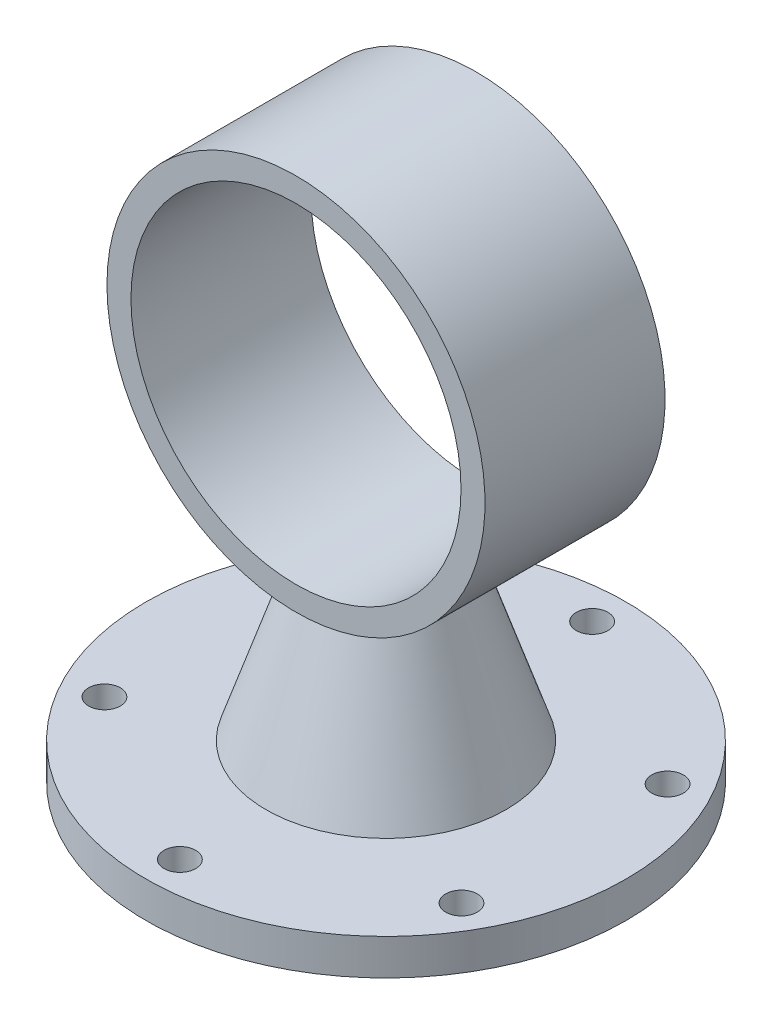
ISO-10303-21;
HEADER;
FILE_DESCRIPTION(('STEP AP214'),'2;1');
FILE_NAME('part.step','',(''),(''),'','','');
FILE_SCHEMA(('AUTOMOTIVE_DESIGN { 1 0 10303 214 1 1 1 1 }'));
ENDSEC;
DATA;
#1=APPLICATION_CONTEXT('core data for automotive mechanical design processes');
#2=APPLICATION_PROTOCOL_DEFINITION('international standard','automotive_design',2000,#1);
#3=PRODUCT_CONTEXT('',#1,'mechanical');
#4=PRODUCT('Part','Part','',(#3));
#5=PRODUCT_RELATED_PRODUCT_CATEGORY('part','',(#4));
#6=PRODUCT_DEFINITION_FORMATION('','',#4);
#7=PRODUCT_DEFINITION_CONTEXT('part definition',#1,'design');
#8=PRODUCT_DEFINITION('design','',#6,#7);
#9=PRODUCT_DEFINITION_SHAPE('','',#8);
#10=(LENGTH_UNIT() NAMED_UNIT(*) SI_UNIT(.MILLI.,.METRE.));
#11=(NAMED_UNIT(*) PLANE_ANGLE_UNIT() SI_UNIT($,.RADIAN.));
#12=(NAMED_UNIT(*) SI_UNIT($,.STERADIAN.) SOLID_ANGLE_UNIT());
#13=UNCERTAINTY_MEASURE_WITH_UNIT(LENGTH_MEASURE(1.E-05),#10,'distance_accuracy_value','');
#14=(GEOMETRIC_REPRESENTATION_CONTEXT(3) GLOBAL_UNCERTAINTY_ASSIGNED_CONTEXT((#13)) GLOBAL_UNIT_ASSIGNED_CONTEXT((#10,
#11,#12)) REPRESENTATION_CONTEXT('',''));
#15=CARTESIAN_POINT('',(0.,0.,0.));
#16=DIRECTION('',(0.,0.,1.));
#17=DIRECTION('',(1.,0.,0.));
#18=AXIS2_PLACEMENT_3D('',#15,#16,#17);
#19=CARTESIAN_POINT('',(0.,15.4305,0.));
#20=DIRECTION('',(0.,1.,0.));
#21=DIRECTION('',(1.,0.,0.));
#22=AXIS2_PLACEMENT_3D('',#19,#20,#21);
#23=PLANE('',#22);
#24=CARTESIAN_POINT('',(0.,15.4305,-26.));
#25=DIRECTION('',(0.,1.,0.));
#26=DIRECTION('',(1.,0.,0.));
#27=AXIS2_PLACEMENT_3D('',#24,#25,#26);
#28=CIRCLE('',#27,2.);
#29=CARTESIAN_POINT('',(-2.,15.4305,-26.));
#30=VERTEX_POINT('',#29);
#31=EDGE_CURVE('E133',#30,#30,#28,.T.);
#32=ORIENTED_EDGE('',*,*,#31,.T.);
#33=EDGE_LOOP('',(#32));
#34=FACE_BOUND('',#33,.T.);
#35=CARTESIAN_POINT('',(0.,15.4305,26.));
#36=DIRECTION('',(0.,1.,0.));
#37=DIRECTION('',(1.,0.,0.));
#38=AXIS2_PLACEMENT_3D('',#35,#36,#37);
#39=CIRCLE('',#38,2.);
#40=CARTESIAN_POINT('',(-2.,15.4305,26.));
#41=VERTEX_POINT('',#40);
#42=EDGE_CURVE('E122',#41,#41,#39,.T.);
#43=ORIENTED_EDGE('',*,*,#42,.T.);
#44=EDGE_LOOP('',(#43));
#45=FACE_BOUND('',#44,.T.);
#46=CARTESIAN_POINT('',(-22.5166604983954,15.4305,13.));
#47=DIRECTION('',(0.,1.,0.));
#48=DIRECTION('',(1.,0.,0.));
#49=AXIS2_PLACEMENT_3D('',#46,#47,#48);
#50=CIRCLE('',#49,2.);
#51=CARTESIAN_POINT('',(-24.5166604983954,15.4305,13.));
#52=VERTEX_POINT('',#51);
#53=EDGE_CURVE('E144',#52,#52,#50,.T.);
#54=ORIENTED_EDGE('',*,*,#53,.T.);
#55=EDGE_LOOP('',(#54));
#56=FACE_BOUND('',#55,.T.);
#57=CARTESIAN_POINT('',(-22.5166604983954,15.4305,-13.));
#58=DIRECTION('',(0.,1.,0.));
#59=DIRECTION('',(1.,0.,0.));
#60=AXIS2_PLACEMENT_3D('',#57,#58,#59);
#61=CIRCLE('',#60,2.);
#62=CARTESIAN_POINT('',(-24.5166604983954,15.4305,-13.));
#63=VERTEX_POINT('',#62);
#64=EDGE_CURVE('E94',#63,#63,#61,.T.);
#65=ORIENTED_EDGE('',*,*,#64,.T.);
#66=EDGE_LOOP('',(#65));
#67=FACE_BOUND('',#66,.T.);
#68=CARTESIAN_POINT('',(22.5166604983954,15.4305,-13.));
#69=DIRECTION('',(0.,1.,0.));
#70=DIRECTION('',(1.,0.,0.));
#71=AXIS2_PLACEMENT_3D('',#68,#69,#70);
#72=CIRCLE('',#71,2.);
#73=CARTESIAN_POINT('',(20.5166604983954,15.4305,-13.));
#74=VERTEX_POINT('',#73);
#75=EDGE_CURVE('E101',#74,#74,#72,.T.);
#76=ORIENTED_EDGE('',*,*,#75,.T.);
#77=EDGE_LOOP('',(#76));
#78=FACE_BOUND('',#77,.T.);
#79=CARTESIAN_POINT('',(22.5166604983954,15.4305,13.));
#80=DIRECTION('',(0.,1.,0.));
#81=DIRECTION('',(1.,0.,0.));
#82=AXIS2_PLACEMENT_3D('',#79,#80,#81);
#83=CIRCLE('',#82,2.);
#84=CARTESIAN_POINT('',(20.5166604983954,15.4305,13.));
#85=VERTEX_POINT('',#84);
#86=EDGE_CURVE('E117',#85,#85,#83,.T.);
#87=ORIENTED_EDGE('',*,*,#86,.T.);
#88=EDGE_LOOP('',(#87));
#89=FACE_BOUND('',#88,.T.);
#90=CARTESIAN_POINT('',(0.,15.4305,0.));
#91=DIRECTION('',(0.,1.,0.));
#92=DIRECTION('',(-1.,0.,0.));
#93=AXIS2_PLACEMENT_3D('',#90,#91,#92);
#94=CIRCLE('',#93,30.28);
#95=CARTESIAN_POINT('',(30.28,15.4305,0.));
#96=VERTEX_POINT('',#95);
#97=EDGE_CURVE('E11',#96,#96,#94,.T.);
#98=ORIENTED_EDGE('',*,*,#97,.F.);
#99=EDGE_LOOP('',(#98));
#100=FACE_BOUND('',#99,.T.);
#101=ADVANCED_FACE('F17',(#34,#45,#56,#67,#78,#89,#100),#23,.F.);
#102=CARTESIAN_POINT('',(0.,19.9725,0.));
#103=DIRECTION('',(0.,1.,0.));
#104=DIRECTION('',(1.,0.,0.));
#105=AXIS2_PLACEMENT_3D('',#102,#103,#104);
#106=PLANE('',#105);
#107=CARTESIAN_POINT('',(0.,19.9725,0.));
#108=DIRECTION('',(0.,-1.,0.));
#109=DIRECTION('',(-1.,0.,0.));
#110=AXIS2_PLACEMENT_3D('',#107,#108,#109);
#111=CIRCLE('',#110,15.14);
#112=CARTESIAN_POINT('',(15.14,19.9725,0.));
#113=VERTEX_POINT('',#112);
#114=EDGE_CURVE('E211',#113,#113,#111,.T.);
#115=ORIENTED_EDGE('',*,*,#114,.T.);
#116=EDGE_LOOP('',(#115));
#117=FACE_BOUND('',#116,.T.);
#118=CARTESIAN_POINT('',(0.,19.9725,-26.));
#119=DIRECTION('',(0.,-1.,0.));
#120=DIRECTION('',(1.,0.,0.));
#121=AXIS2_PLACEMENT_3D('',#118,#119,#120);
#122=CIRCLE('',#121,2.);
#123=CARTESIAN_POINT('',(-2.,19.9725,-26.));
#124=VERTEX_POINT('',#123);
#125=EDGE_CURVE('E118',#124,#124,#122,.T.);
#126=ORIENTED_EDGE('',*,*,#125,.T.);
#127=EDGE_LOOP('',(#126));
#128=FACE_BOUND('',#127,.T.);
#129=CARTESIAN_POINT('',(0.,19.9725,26.));
#130=DIRECTION('',(0.,-1.,0.));
#131=DIRECTION('',(1.,0.,0.));
#132=AXIS2_PLACEMENT_3D('',#129,#130,#131);
#133=CIRCLE('',#132,2.);
#134=CARTESIAN_POINT('',(-2.,19.9725,26.));
#135=VERTEX_POINT('',#134);
#136=EDGE_CURVE('E142',#135,#135,#133,.T.);
#137=ORIENTED_EDGE('',*,*,#136,.T.);
#138=EDGE_LOOP('',(#137));
#139=FACE_BOUND('',#138,.T.);
#140=CARTESIAN_POINT('',(-22.5166604983954,19.9725,13.));
#141=DIRECTION('',(0.,-1.,0.));
#142=DIRECTION('',(1.,0.,0.));
#143=AXIS2_PLACEMENT_3D('',#140,#141,#142);
#144=CIRCLE('',#143,2.);
#145=CARTESIAN_POINT('',(-24.5166604983954,19.9725,13.));
#146=VERTEX_POINT('',#145);
#147=EDGE_CURVE('E238',#146,#146,#144,.T.);
#148=ORIENTED_EDGE('',*,*,#147,.T.);
#149=EDGE_LOOP('',(#148));
#150=FACE_BOUND('',#149,.T.);
#151=CARTESIAN_POINT('',(-22.5166604983954,19.9725,-13.));
#152=DIRECTION('',(0.,-1.,0.));
#153=DIRECTION('',(1.,0.,0.));
#154=AXIS2_PLACEMENT_3D('',#151,#152,#153);
#155=CIRCLE('',#154,2.);
#156=CARTESIAN_POINT('',(-24.5166604983954,19.9725,-13.));
#157=VERTEX_POINT('',#156);
#158=EDGE_CURVE('E93',#157,#157,#155,.T.);
#159=ORIENTED_EDGE('',*,*,#158,.T.);
#160=EDGE_LOOP('',(#159));
#161=FACE_BOUND('',#160,.T.);
#162=CARTESIAN_POINT('',(22.5166604983954,19.9725,-13.));
#163=DIRECTION('',(0.,-1.,0.));
#164=DIRECTION('',(1.,0.,0.));
#165=AXIS2_PLACEMENT_3D('',#162,#163,#164);
#166=CIRCLE('',#165,2.);
#167=CARTESIAN_POINT('',(20.5166604983954,19.9725,-13.));
#168=VERTEX_POINT('',#167);
#169=EDGE_CURVE('E113',#168,#168,#166,.T.);
#170=ORIENTED_EDGE('',*,*,#169,.T.);
#171=EDGE_LOOP('',(#170));
#172=FACE_BOUND('',#171,.T.);
#173=CARTESIAN_POINT('',(22.5166604983954,19.9725,13.));
#174=DIRECTION('',(0.,-1.,0.));
#175=DIRECTION('',(1.,0.,0.));
#176=AXIS2_PLACEMENT_3D('',#173,#174,#175);
#177=CIRCLE('',#176,2.);
#178=CARTESIAN_POINT('',(20.5166604983954,19.9725,13.));
#179=VERTEX_POINT('',#178);
#180=EDGE_CURVE('E128',#179,#179,#177,.T.);
#181=ORIENTED_EDGE('',*,*,#180,.T.);
#182=EDGE_LOOP('',(#181));
#183=FACE_BOUND('',#182,.T.);
#184=CARTESIAN_POINT('',(0.,19.9725,0.));
#185=DIRECTION('',(0.,1.,0.));
#186=DIRECTION('',(-1.,0.,0.));
#187=AXIS2_PLACEMENT_3D('',#184,#185,#186);
#188=CIRCLE('',#187,30.28);
#189=CARTESIAN_POINT('',(30.28,19.9725,0.));
#190=VERTEX_POINT('',#189);
#191=EDGE_CURVE('E218',#190,#190,#188,.T.);
#192=ORIENTED_EDGE('',*,*,#191,.T.);
#193=EDGE_LOOP('',(#192));
#194=FACE_BOUND('',#193,.T.);
#195=ADVANCED_FACE('F98',(#117,#128,#139,#150,#161,#172,#183,#194),#106,.T.);
#196=CARTESIAN_POINT('',(0.,15.4305,0.));
#197=DIRECTION('',(0.,1.,0.));
#198=DIRECTION('',(-1.,0.,0.));
#199=AXIS2_PLACEMENT_3D('',#196,#197,#198);
#200=CYLINDRICAL_SURFACE('',#199,30.28);
#201=ORIENTED_EDGE('',*,*,#191,.F.);
#202=DIRECTION('',(0.,-1.,0.));
#203=VECTOR('',#202,1.);
#204=CARTESIAN_POINT('',(30.28,15.4305,0.));
#205=LINE('',#204,#203);
#206=EDGE_CURVE('E28',#190,#96,#205,.T.);
#207=ORIENTED_EDGE('',*,*,#206,.T.);
#208=ORIENTED_EDGE('',*,*,#97,.T.);
#209=ORIENTED_EDGE('',*,*,#206,.F.);
#210=EDGE_LOOP('',(#201,#207,#208,#209));
#211=FACE_BOUND('',#210,.T.);
#212=ADVANCED_FACE('F185',(#211),#200,.T.);
#213=CARTESIAN_POINT('',(0.,19.9725,0.));
#214=DIRECTION('',(0.,-1.,0.));
#215=DIRECTION('',(-1.,0.,0.));
#216=AXIS2_PLACEMENT_3D('',#213,#214,#215);
#217=CONICAL_SURFACE('',#216,15.14,0.321750554396642);
#218=CARTESIAN_POINT('',(8.10598397504346,41.0745480748695,0.));
#219=CARTESIAN_POINT('',(8.10599228552772,41.0745540208151,-0.134226241129684));
#220=CARTESIAN_POINT('',(8.1028935410508,41.0734310697929,-0.268445663162191));
#221=CARTESIAN_POINT('',(8.09057676877823,41.0689831641918,-0.537389582434754));
#222=CARTESIAN_POINT('',(8.08132149296634,41.065644806333,-0.672112159678158));
#223=CARTESIAN_POINT('',(8.0566866521417,41.0567864766006,-0.942060539232158));
#224=CARTESIAN_POINT('',(8.0412564344081,41.0512484639577,-1.0772811033043));
#225=CARTESIAN_POINT('',(8.0042778142821,41.0380366481614,-1.34822950689059));
#226=CARTESIAN_POINT('',(7.98266664241168,41.0303409497071,-1.48394767203641));
#227=CARTESIAN_POINT('',(7.93294622322821,41.0127380174252,-1.75786444264333));
#228=CARTESIAN_POINT('',(7.90467662864205,41.002776462063,-1.89603048453122));
#229=CARTESIAN_POINT('',(7.84209051245139,40.9808842187862,-2.16964907004523));
#230=CARTESIAN_POINT('',(7.80782473317279,40.9689701041103,-2.30511452114365));
#231=CARTESIAN_POINT('',(7.73323894846208,40.9432619239084,-2.57333337094648));
#232=CARTESIAN_POINT('',(7.69295532110676,40.9294791975679,-2.70609796205588));
#233=CARTESIAN_POINT('',(7.60630703274597,40.9001316911964,-2.96891364955428));
#234=CARTESIAN_POINT('',(7.55996390521049,40.8845732452708,-3.09897254828746));
#235=CARTESIAN_POINT('',(7.46125198232622,40.851814942625,-3.35628439300228));
#236=CARTESIAN_POINT('',(7.40889478376835,40.8346182554657,-3.48354219359469));
#237=CARTESIAN_POINT('',(7.2980012203605,40.7986682752877,-3.73585244968003));
#238=CARTESIAN_POINT('',(7.23943636327919,40.7799078973244,-3.86089136422041));
#239=CARTESIAN_POINT('',(7.1160910121384,40.7409725534611,-4.10876810734915));
#240=CARTESIAN_POINT('',(7.05126932933246,40.7207884875695,-4.23158399764496));
#241=CARTESIAN_POINT('',(6.91537987563583,40.6791655545478,-4.47502269635304));
#242=CARTESIAN_POINT('',(6.84425959620739,40.6577167588898,-4.59561446334909));
#243=CARTESIAN_POINT('',(6.69878712096547,40.6146398351422,-4.82972020267625));
#244=CARTESIAN_POINT('',(6.62459469453514,40.5930361572173,-4.94333799837689));
#245=CARTESIAN_POINT('',(6.47180503906243,40.549403989662,-5.16581816644314));
#246=CARTESIAN_POINT('',(6.39325801553339,40.5273817254114,-5.27471619252933));
#247=CARTESIAN_POINT('',(6.23174287146417,40.4830451733675,-5.48775963053089));
#248=CARTESIAN_POINT('',(6.14881379053932,40.4607344780282,-5.59193536623458));
#249=CARTESIAN_POINT('',(5.9785161388208,40.4159595905303,-5.79553708818833));
#250=CARTESIAN_POINT('',(5.89117520447296,40.3934969707572,-5.8949865224806));
#251=CARTESIAN_POINT('',(5.71119446348144,40.3483524027356,-6.09008738730319));
#252=CARTESIAN_POINT('',(5.6185253522981,40.3256699554786,-6.18571167499423));
#253=CARTESIAN_POINT('',(5.42839038863037,40.2803958110863,-6.37251974276535));
#254=CARTESIAN_POINT('',(5.33091464279367,40.2578044142869,-6.46369352410941));
#255=CARTESIAN_POINT('',(5.13114756005437,40.2128850851713,-6.6416069215847));
#256=CARTESIAN_POINT('',(5.02883693541597,40.1905587478645,-6.72832528043372));
#257=CARTESIAN_POINT('',(4.81939343396698,40.1463526267747,-6.89734366155247));
#258=CARTESIAN_POINT('',(4.71223323075272,40.1244767534334,-6.97961081550864));
#259=CARTESIAN_POINT('',(4.49023431028415,40.0808003873347,-7.14179083994862));
#260=CARTESIAN_POINT('',(4.37525819966085,40.0590287202313,-7.22152362064177));
#261=CARTESIAN_POINT('',(4.14272272102674,40.0168252089888,-7.37408391605919));
#262=CARTESIAN_POINT('',(4.02521540327887,39.9963797614168,-7.44698688391547));
#263=CARTESIAN_POINT('',(3.7876428587313,39.956933549685,-7.58590142892722));
#264=CARTESIAN_POINT('',(3.66761740953222,39.93791987766,-7.65197729012282));
#265=CARTESIAN_POINT('',(3.42503212438874,39.9014418253488,-7.77724819704724));
#266=CARTESIAN_POINT('',(3.3025002287703,39.8839662721872,-7.83649403900675));
#267=CARTESIAN_POINT('',(3.05337429850847,39.850461259448,-7.94882112154026));
#268=CARTESIAN_POINT('',(2.92675745878384,39.8344430511457,-8.00185518071147));
#269=CARTESIAN_POINT('',(2.67057885235985,39.8041664791088,-8.10113662434849));
#270=CARTESIAN_POINT('',(2.54101503721802,39.7899093867222,-8.14737911048218));
#271=CARTESIAN_POINT('',(2.27897049093139,39.7632864983942,-8.23309671714051));
#272=CARTESIAN_POINT('',(2.14648113528276,39.7509274990714,-8.27254757675482));
#273=CARTESIAN_POINT('',(1.87861691314948,39.7282342572368,-8.34470058842314));
#274=CARTESIAN_POINT('',(1.74322920675397,39.7179131183138,-8.37735913270832));
#275=CARTESIAN_POINT('',(1.47338222827223,39.6996857401668,-8.43513931964788));
#276=CARTESIAN_POINT('',(1.33895380649629,39.6917375288183,-8.46039179774045));
#277=CARTESIAN_POINT('',(1.0703529665686,39.6781593407874,-8.50360966340676));
#278=CARTESIAN_POINT('',(0.936194451879281,39.672504468489,-8.52165327389404));
#279=CARTESIAN_POINT('',(0.668182043726237,39.6634896319526,-8.55046785172429));
#280=CARTESIAN_POINT('',(0.534335370036393,39.6601104409051,-8.56129974047415));
#281=CARTESIAN_POINT('',(0.266990835086297,39.6556221543521,-8.57571080381577));
#282=CARTESIAN_POINT('',(0.13349545672282,39.6544999996571,-8.57933169992799));
#283=CARTESIAN_POINT('',(-0.133454477455421,39.6545000003428,-8.57933496623726));
#284=CARTESIAN_POINT('',(-0.266909033222084,39.6556214668907,-8.57571955811247));
#285=CARTESIAN_POINT('',(-0.534199211973135,39.6601074656276,-8.56131581095495));
#286=CARTESIAN_POINT('',(-0.668032264384554,39.6634855115075,-8.55048425857094));
#287=CARTESIAN_POINT('',(-0.936044664199146,39.6724985057343,-8.52166897670078));
#288=CARTESIAN_POINT('',(-1.07021661975496,39.6781531352781,-8.50362288691295));
#289=CARTESIAN_POINT('',(-1.33887214324759,39.6917327062201,-8.46040054900051));
#290=CARTESIAN_POINT('',(-1.47334157000986,39.6996829933127,-8.43514473792432));
#291=CARTESIAN_POINT('',(-1.74318888003728,39.7179103948777,-8.37737111645127));
#292=CARTESIAN_POINT('',(-1.87853688811407,39.7282281623238,-8.34472658292363));
#293=CARTESIAN_POINT('',(-2.14634834409802,39.7509155690328,-8.27259224221701));
#294=CARTESIAN_POINT('',(-2.27882422326767,39.7632725317862,-8.23314466138967));
#295=CARTESIAN_POINT('',(-2.54086872418094,39.7898936320559,-8.1474263751858));
#296=CARTESIAN_POINT('',(-2.67044547044304,39.8041513674904,-8.10117852251852));
#297=CARTESIAN_POINT('',(-2.92667782701638,39.8344329885802,-8.00188116058868));
#298=CARTESIAN_POINT('',(-3.0533349069009,39.8504559611708,-7.94883516535262));
#299=CARTESIAN_POINT('',(-3.30246342902233,39.8839613234649,-7.8365143200287));
#300=CARTESIAN_POINT('',(-3.4249596290129,39.9014314967356,-7.7772906966396));
#301=CARTESIAN_POINT('',(-3.66749752723076,39.9379012737716,-7.6520493940719));
#302=CARTESIAN_POINT('',(-3.78751055780025,39.9569123286154,-7.58597959013245));
#303=CARTESIAN_POINT('',(-4.02508301125295,39.9963570260611,-7.44706443950968));
#304=CARTESIAN_POINT('',(-4.14260189047806,40.0168038244582,-7.37415357420716));
#305=CARTESIAN_POINT('',(-4.37518624722481,40.0590151091939,-7.22156610175574));
#306=CARTESIAN_POINT('',(-4.49019890244395,40.0807934208883,-7.14181292487126));
#307=CARTESIAN_POINT('',(-4.7122019653679,40.1244706024909,-6.97963730958388));
#308=CARTESIAN_POINT('',(-4.81933218265364,40.1463401342361,-6.89739814134485));
#309=CARTESIAN_POINT('',(-5.02873589114185,40.1905369886015,-6.7284170315032));
#310=CARTESIAN_POINT('',(-5.13103588538245,40.2128605260781,-6.64170697097608));
#311=CARTESIAN_POINT('',(-5.33080279353243,40.2577787150375,-6.46379309090589));
#312=CARTESIAN_POINT('',(-5.428288100483,40.2803718457265,-6.37260954170426));
#313=CARTESIAN_POINT('',(-5.6184646307383,40.3256551067791,-6.1857661503857));
#314=CARTESIAN_POINT('',(-5.71116480420827,40.3483449632398,-6.09011535354834));
#315=CARTESIAN_POINT('',(-5.89114964752676,40.3934905603687,-5.89501838300296));
#316=CARTESIAN_POINT('',(-5.97846655072113,40.4159468491915,-5.79560206700473));
#317=CARTESIAN_POINT('',(-6.14873233262076,40.4607127630418,-5.59204448367217));
#318=CARTESIAN_POINT('',(-6.23165255762026,40.4830207530186,-5.48787890332985));
#319=CARTESIAN_POINT('',(-6.39316741660652,40.527356481948,-5.27483507390466));
#320=CARTESIAN_POINT('',(-6.4717219918158,40.5493805345838,-5.16592571086832));
#321=CARTESIAN_POINT('',(-6.62454553108781,40.5930218543776,-4.94340297744406));
#322=CARTESIAN_POINT('',(-6.69876329843015,40.6146327810176,-4.82975324966532));
#323=CARTESIAN_POINT('',(-6.84423984138364,40.6577109089981,-4.59565170391255));
#324=CARTESIAN_POINT('',(-6.91534201433778,40.6791541471022,-4.4750981125657));
#325=CARTESIAN_POINT('',(-7.05120744847361,40.7207693457471,-4.23171028384059));
#326=CARTESIAN_POINT('',(-7.11602211419825,40.7409510307606,-4.10890643715852));
#327=CARTESIAN_POINT('',(-7.23936703317627,40.7798857885693,-3.86102939427003));
#328=CARTESIAN_POINT('',(-7.2979372949484,40.798647700716,-3.73597750651334));
#329=CARTESIAN_POINT('',(-7.40885719807603,40.8346059225375,-3.48361760802232));
#330=CARTESIAN_POINT('',(-7.46123410393945,40.8518090097664,-3.35632255506132));
#331=CARTESIAN_POINT('',(-7.55995167820104,40.8845691874242,-3.09901287269031));
#332=CARTESIAN_POINT('',(-7.60628447587182,40.9001241267604,-2.9689949480903));
#333=CARTESIAN_POINT('',(-7.69291905841035,40.9294668397403,-2.70623385787374));
#334=CARTESIAN_POINT('',(-7.73319803950913,40.9432479048239,-2.57348242907009));
#335=CARTESIAN_POINT('',(-7.80778322710309,40.9689557160509,-2.30526337891982));
#336=CARTESIAN_POINT('',(-7.84205179657443,40.980870730563,-2.16978417893301));
#337=CARTESIAN_POINT('',(-7.90465426321771,41.0027685839608,-1.89611178914783));
#338=CARTESIAN_POINT('',(-7.93293620743287,41.0127344554377,-1.75790538284825));
#339=CARTESIAN_POINT('',(-7.98265796966322,41.0303378947999,-1.48400930325459));
#340=CARTESIAN_POINT('',(-8.00426263788001,41.0380313077414,-1.3483531134475));
#341=CARTESIAN_POINT('',(-8.04123238844538,41.051239791827,-1.07748712677671));
#342=CARTESIAN_POINT('',(-8.05665847742817,41.0567761458976,-0.94228673517096));
#343=CARTESIAN_POINT('',(-8.08129372850655,41.0656350195064,-0.67233890239427));
#344=CARTESIAN_POINT('',(-8.090551661023,41.0689749033239,-0.537596496828097));
#345=CARTESIAN_POINT('',(-8.10287576428526,41.073423854315,-0.268568257438402));
#346=CARTESIAN_POINT('',(-8.10597730841317,41.0745456659441,-0.134284267071368));
#347=CARTESIAN_POINT('',(-8.10599063654547,41.0745504819419,0.134180968299907));
#348=CARTESIAN_POINT('',(-8.10290718021509,41.0734352078591,0.268362212878599));
#349=CARTESIAN_POINT('',(-8.09060663079576,41.0689947348015,0.537253556233039));
#350=CARTESIAN_POINT('',(-8.08135094248745,41.0656556302948,0.67196164668727));
#351=CARTESIAN_POINT('',(-8.05671431445401,41.056796188329,0.941909511683192));
#352=CARTESIAN_POINT('',(-8.04128147957607,41.0512573739201,1.07714392482473));
#353=CARTESIAN_POINT('',(-8.00429375088915,41.0380423806461,1.34814744509327));
#354=CARTESIAN_POINT('',(-7.98267486366089,41.0303438774818,1.48390668659693));
#355=CARTESIAN_POINT('',(-7.93294545035107,41.0127377261999,1.75786427849699));
#356=CARTESIAN_POINT('',(-7.90467642237258,41.0027763843393,1.89603044072427));
#357=CARTESIAN_POINT('',(-7.84209071705222,40.9808842958812,2.1696491135017));
#358=CARTESIAN_POINT('',(-7.80782478783994,40.9689701247093,2.30511453275677));
#359=CARTESIAN_POINT('',(-7.7332388941118,40.9432619034289,2.57333335940601));
#360=CARTESIAN_POINT('',(-7.69295530656762,40.9294791920895,2.70609795897046));
#361=CARTESIAN_POINT('',(-7.60630704723406,40.9001316966557,2.96891365263277));
#362=CARTESIAN_POINT('',(-7.55996390908936,40.8845732467324,3.0989725491119));
#363=CARTESIAN_POINT('',(-7.46125197844377,40.8518149411625,3.35628439220852));
#364=CARTESIAN_POINT('',(-7.40889478270691,40.8346182550668,3.48354219343078));
#365=CARTESIAN_POINT('',(-7.29800122136911,40.7986682756697,3.73585244999664));
#366=CARTESIAN_POINT('',(-7.23943636352045,40.7799078974176,3.86089136438442));
#367=CARTESIAN_POINT('',(-7.11609101181576,40.7409725533421,4.10876810739358));
#368=CARTESIAN_POINT('',(-7.051269329221,40.7207884875299,4.23158399772431));
#369=CARTESIAN_POINT('',(-6.91537987569111,40.6791655545702,4.47502269642666));
#370=CARTESIAN_POINT('',(-6.84425959621656,40.6577167588941,4.595614463382));
#371=CARTESIAN_POINT('',(-6.69878712093931,40.6146398351329,4.82972020267173));
#372=CARTESIAN_POINT('',(-6.6245946945164,40.5930361572114,4.94333799837441));
#373=CARTESIAN_POINT('',(-6.47180503904536,40.5494039896577,5.16581816644189));
#374=CARTESIAN_POINT('',(-6.3932580155108,40.5273817254053,5.27471619252735));
#375=CARTESIAN_POINT('',(-6.23174287143887,40.4830451733605,5.48775963052823));
#376=CARTESIAN_POINT('',(-6.14881379051687,40.4607344780222,5.59193536623202));
#377=CARTESIAN_POINT('',(-5.97851613880779,40.415959590527,5.79553708818678));
#378=CARTESIAN_POINT('',(-5.89117520446664,40.3934969707557,5.89498652248003));
#379=CARTESIAN_POINT('',(-5.71119446350289,40.348352402741,6.09008738728722));
#380=CARTESIAN_POINT('',(-5.61852535234143,40.3256699554892,6.18571167496263));
#381=CARTESIAN_POINT('',(-5.42839038870294,40.2803958111033,6.37251974271291));
#382=CARTESIAN_POINT('',(-5.33091464287298,40.2578044143052,6.46369352405113));
#383=CARTESIAN_POINT('',(-5.13114756013365,40.2128850851888,6.64160692152625));
#384=CARTESIAN_POINT('',(-5.02883693548788,40.19055874788,6.72832528038028));
#385=CARTESIAN_POINT('',(-4.81939343401048,40.1463526267836,6.89734366152076));
#386=CARTESIAN_POINT('',(-4.71223323077462,40.1244767534377,6.97961081549298));
#387=CARTESIAN_POINT('',(-4.49023431028487,40.0808003873348,7.14179083994776));
#388=CARTESIAN_POINT('',(-4.37525819966284,40.0590287202317,7.22152362064077));
#389=CARTESIAN_POINT('',(-4.14272272103027,40.0168252089894,7.37408391605783));
#390=CARTESIAN_POINT('',(-4.02521540328268,39.9963797614174,7.44698688391385));
#391=CARTESIAN_POINT('',(-3.78764285873505,39.9569335496856,7.58590142892553));
#392=CARTESIAN_POINT('',(-3.66761740953563,39.9379198776605,7.65197729012128));
#393=CARTESIAN_POINT('',(-3.4250321243908,39.9014418253491,7.77724819704635));
#394=CARTESIAN_POINT('',(-3.30250022877133,39.8839662721873,7.83649403900632));
#395=CARTESIAN_POINT('',(-3.05337429850844,39.850461259448,7.94882112154025));
#396=CARTESIAN_POINT('',(-2.92675745878381,39.8344430511457,8.00185518071147));
#397=CARTESIAN_POINT('',(-2.67057885235982,39.8041664791088,8.10113662434849));
#398=CARTESIAN_POINT('',(-2.541015037218,39.7899093867222,8.14737911048218));
#399=CARTESIAN_POINT('',(-2.27897049093137,39.7632864983942,8.23309671714051));
#400=CARTESIAN_POINT('',(-2.14648113528274,39.7509274990714,8.27254757675482));
#401=CARTESIAN_POINT('',(-1.87861691314948,39.7282342572368,8.34470058842314));
#402=CARTESIAN_POINT('',(-1.74322920675397,39.7179131183138,8.37735913270833));
#403=CARTESIAN_POINT('',(-1.47338222827223,39.6996857401668,8.43513931964789));
#404=CARTESIAN_POINT('',(-1.3389538064963,39.6917375288183,8.46039179774046));
#405=CARTESIAN_POINT('',(-1.0703529665686,39.6781593407874,8.50360966340677));
#406=CARTESIAN_POINT('',(-0.93619445187929,39.672504468489,8.52165327389406));
#407=CARTESIAN_POINT('',(-0.668182043726246,39.6634896319526,8.55046785172428));
#408=CARTESIAN_POINT('',(-0.534335370036402,39.6601104409051,8.5612997404741));
#409=CARTESIAN_POINT('',(-0.266990835086305,39.6556221543521,8.57571080381582));
#410=CARTESIAN_POINT('',(-0.133495456722827,39.6544999996571,8.57933169992818));
#411=CARTESIAN_POINT('',(0.133454477446243,39.6545000003428,8.57933496623707));
#412=CARTESIAN_POINT('',(0.266909033203734,39.6556214668906,8.57571955811224));
#413=CARTESIAN_POINT('',(0.534199211942556,39.6601074656269,8.56131581095483));
#414=CARTESIAN_POINT('',(0.668032264350899,39.6634855115066,8.55048425857064));
#415=CARTESIAN_POINT('',(0.936044664165465,39.672498505733,8.52166897670041));
#416=CARTESIAN_POINT('',(1.07021661972429,39.6781531352767,8.50362288691237));
#417=CARTESIAN_POINT('',(1.33887214322915,39.691732706219,8.46040054900014));
#418=CARTESIAN_POINT('',(1.47334157000059,39.6996829933121,8.43514473792406));
#419=CARTESIAN_POINT('',(1.74318888004591,39.7179103948783,8.37737111645168));
#420=CARTESIAN_POINT('',(1.87853688813144,39.7282281623252,8.34472658292463));
#421=CARTESIAN_POINT('',(2.14634834412692,39.7509155690354,8.27259224221834));
#422=CARTESIAN_POINT('',(2.27882422329944,39.7632725317893,8.23314466139103));
#423=CARTESIAN_POINT('',(2.54086872421282,39.7898936320593,8.14742637518731));
#424=CARTESIAN_POINT('',(2.67044547047225,39.8041513674937,8.10117852252042));
#425=CARTESIAN_POINT('',(2.92667782703383,39.8344329885824,8.00188116058953));
#426=CARTESIAN_POINT('',(3.05333490690936,39.850455961172,7.94883516535228));
#427=CARTESIAN_POINT('',(3.3024634290572,39.8839613234696,7.8365143200095));
#428=CARTESIAN_POINT('',(3.42495962908205,39.9014314967454,7.7772906966004));
#429=CARTESIAN_POINT('',(3.66749752734529,39.9379012737894,7.65204939400577));
#430=CARTESIAN_POINT('',(3.78751055792658,39.9569123286357,7.58597959006063));
#431=CARTESIAN_POINT('',(4.02508301137932,39.9963570260828,7.44706443943831));
#432=CARTESIAN_POINT('',(4.14260189059339,40.0168038244786,7.37415357414309));
#433=CARTESIAN_POINT('',(4.3751862472936,40.0590151092069,7.22156610171678));
#434=CARTESIAN_POINT('',(4.49019890247796,40.080793420895,7.14181292485117));
#435=CARTESIAN_POINT('',(4.71220196538534,40.1244706024944,6.97963730956655));
#436=CARTESIAN_POINT('',(4.81933218268744,40.146340134243,6.897398141309));
#437=CARTESIAN_POINT('',(5.02873589119756,40.1905369886135,6.72841703144293));
#438=CARTESIAN_POINT('',(5.13103588544419,40.2128605260917,6.64170697091051));
#439=CARTESIAN_POINT('',(5.33080279359424,40.2577787150517,6.46379309084064));
#440=CARTESIAN_POINT('',(5.42828810053937,40.2803718457397,6.3726095416452));
#441=CARTESIAN_POINT('',(5.61846463077169,40.3256551067873,6.18576615034995));
#442=CARTESIAN_POINT('',(5.71116480422467,40.3483449632439,6.09011535353026));
#443=CARTESIAN_POINT('',(5.89114964753094,40.3934905603697,5.89501838299873));
#444=CARTESIAN_POINT('',(5.978466550729,40.4159468491936,5.79560206699567));
#445=CARTESIAN_POINT('',(6.14873233263271,40.460712763045,5.59204448365661));
#446=CARTESIAN_POINT('',(6.23165255763273,40.4830207530219,5.48787890331276));
#447=CARTESIAN_POINT('',(6.39316741662148,40.5273564819523,5.27483507388805));
#448=CARTESIAN_POINT('',(6.4717219918329,40.5493805345888,5.16592571085385));
#449=CARTESIAN_POINT('',(6.62454553109086,40.5930218543783,4.94340297743415));
#450=CARTESIAN_POINT('',(6.69876329841702,40.6146327810131,4.8297532496579));
#451=CARTESIAN_POINT('',(6.8442398413869,40.6577109089996,4.59565170393723));
#452=CARTESIAN_POINT('',(6.9153420143762,40.6791541471157,4.47509811262078));
#453=CARTESIAN_POINT('',(7.05120744835842,40.7207693457101,4.23171028390087));
#454=CARTESIAN_POINT('',(7.1160221138957,40.7409510306615,4.10890643719354));
#455=CARTESIAN_POINT('',(7.23936703337044,40.7798857886342,3.86102939439315));
#456=CARTESIAN_POINT('',(7.29793729582004,40.7986477010047,3.73597750674839));
#457=CARTESIAN_POINT('',(7.40885719712981,40.8346059222246,3.48361760790287));
#458=CARTESIAN_POINT('',(7.46123410051174,40.8518090086326,3.35632255447766));
#459=CARTESIAN_POINT('',(7.55995168161365,40.884569188553,3.09901287332511));
#460=CARTESIAN_POINT('',(7.60628448862389,40.9001241309783,2.96899495041147));
#461=CARTESIAN_POINT('',(7.69291904558729,40.9294668354987,2.7062338556965));
#462=CARTESIAN_POINT('',(7.73319799160776,40.9432478889796,2.57348242067886));
#463=CARTESIAN_POINT('',(7.80778327525968,40.9689557319792,2.30526338757087));
#464=CARTESIAN_POINT('',(7.84205197687398,40.9808707901996,2.16978421101881));
#465=CARTESIAN_POINT('',(7.90465408138673,41.0027685238173,1.89611175694623));
#466=CARTESIAN_POINT('',(7.93293552608681,41.012734230072,1.75790526199448));
#467=CARTESIAN_POINT('',(7.98266610820409,41.0303407607285,1.48396824160256));
#468=CARTESIAN_POINT('',(8.00427825598654,41.038036807419,1.34827082755878));
#469=CARTESIAN_POINT('',(8.04125779140665,41.0512489473602,1.07734999053196));
#470=CARTESIAN_POINT('',(8.05668739973327,41.05678674475,0.942136158787232));
#471=CARTESIAN_POINT('',(8.08132198745317,41.0656449848113,0.672187694923394));
#472=CARTESIAN_POINT('',(8.0905770150576,41.0689832530064,0.537458237885682));
#473=CARTESIAN_POINT('',(8.10289392673948,41.0734312091976,0.26848684669692));
#474=CARTESIAN_POINT('',(8.10599243422003,41.0745540757117,0.134246800264123));
#475=CARTESIAN_POINT('',(8.10598397504346,41.0745480748695,0.));
#476=B_SPLINE_CURVE_WITH_KNOTS('',3,(#218,#219,#220,#221,#222,#223,#224,#225,#226,#227,#228,
#229,#230,#231,#232,#233,#234,#235,#236,#237,#238,#239,#240,#241,#242,#243,#244,#245,#246,#247,
#248,#249,#250,#251,#252,#253,#254,#255,#256,#257,#258,#259,#260,#261,#262,#263,#264,#265,#266,
#267,#268,#269,#270,#271,#272,#273,#274,#275,#276,#277,#278,#279,#280,#281,#282,#283,#284,#285,
#286,#287,#288,#289,#290,#291,#292,#293,#294,#295,#296,#297,#298,#299,#300,#301,#302,#303,#304,
#305,#306,#307,#308,#309,#310,#311,#312,#313,#314,#315,#316,#317,#318,#319,#320,#321,#322,#323,
#324,#325,#326,#327,#328,#329,#330,#331,#332,#333,#334,#335,#336,#337,#338,#339,#340,#341,#342,
#343,#344,#345,#346,#347,#348,#349,#350,#351,#352,#353,#354,#355,#356,#357,#358,#359,#360,#361,
#362,#363,#364,#365,#366,#367,#368,#369,#370,#371,#372,#373,#374,#375,#376,#377,#378,#379,#380,
#381,#382,#383,#384,#385,#386,#387,#388,#389,#390,#391,#392,#393,#394,#395,#396,#397,#398,#399,
#400,#401,#402,#403,#404,#405,#406,#407,#408,#409,#410,#411,#412,#413,#414,#415,#416,#417,#418,
#419,#420,#421,#422,#423,#424,#425,#426,#427,#428,#429,#430,#431,#432,#433,#434,#435,#436,#437,
#438,#439,#440,#441,#442,#443,#444,#445,#446,#447,#448,#449,#450,#451,#452,#453,#454,#455,#456,
#457,#458,#459,#460,#461,#462,#463,#464,#465,#466,#467,#468,#469,#470,#471,#472,#473,#474,#475),
.UNSPECIFIED.,.F.,.F.,(4,2,2,2,2,2,2,2,2,2,2,2,2,2,2,2,2,2,2,2,2,2,2,2,2,2,2,2,2,2,2,2,2,2,2,2,
2,2,2,2,2,2,2,2,2,2,2,2,2,2,2,2,2,2,2,2,2,2,2,2,2,2,2,2,2,2,2,2,2,2,2,2,2,2,2,2,2,2,2,2,2,2,2,2,
2,2,2,2,2,2,2,2,2,2,2,2,2,2,2,2,2,2,2,2,2,2,2,2,2,2,2,2,2,2,2,2,2,2,2,2,2,2,2,2,2,2,2,2,4),(0.,
0.402627959123433,0.807714311832975,1.21619400716931,1.62897893600694,2.05295970533657,
2.47351226316759,2.8916183901697,3.30827715772478,3.72414556872883,4.14201297197669,
4.56284800824947,4.98759901018839,5.39967534674199,5.80771945477538,6.21259699661347,
6.61519405896128,7.02026899249713,7.4262156404124,7.83394704497514,8.24436433357742,
8.66898943567971,9.08816805738823,9.50294827561753,9.91441177893239,10.3288216885061,
10.7435290332476,11.1596883601703,11.5784422057747,11.9892780185159,12.3955262107274,
12.7982975191806,13.1987316145656,13.5990427881952,14.0017730061267,14.4080622884855,
14.8190210373924,15.2376488088827,15.6537659992131,16.0685154773998,16.4830514257748,
16.8943884222331,17.3091263546805,17.7283472676937,18.1530989468189,18.5633922480266,
18.9710822301166,19.3770703028863,19.7822692381209,20.1847425779821,20.5895787894953,
20.9976642263724,21.4098642846955,21.8344879292026,22.2552804220055,22.6731903646306,
23.0891860841728,23.5057182238799,23.9237820372629,24.3443769115285,24.7684843446034,
25.1810825568349,25.5894999662843,25.9946485125725,26.3974623385915,26.7999662982777,
27.205011031574,27.6135325331229,28.0264431533383,28.4504239226701,28.8709764805018,
29.2890826075032,29.7057413750561,30.1216097861521,30.5394771894305,30.9603122256729,
31.3850632275212,31.7971395640847,32.2051836721216,32.6100612139559,33.0126582762917,
33.4177332097466,33.8236798576348,34.2314112622247,34.6418285509088,35.0664536530077,
35.4856322747151,35.9004124929456,36.3118759962638,36.7262859058376,37.1409932505791,
37.5571525775017,37.9759064231061,38.3867422358473,38.7929904280589,39.195761736512,
39.596195831897,39.9965070054991,40.3992372234215,40.8055265057893,41.2164852547233,
41.6351130262387,42.0512302165773,42.465979694756,42.8805156431072,43.2918526396853,
43.7065905721727,44.125811485146,44.5505631641515,44.9608564654328,45.3685464475475,
45.7745345202924,46.1797334554526,46.5822067953318,46.987043006851,47.3951284437222,
47.8073285020274,48.2319521464553,48.6527446392319,49.0706545818831,49.486650301503,
49.903182441125,50.3212462544794,50.7418411287738,51.165948561935,51.5786725698482,
51.9871318201087,52.3922387125701,52.7949284359817),.UNSPECIFIED.);
#477=CARTESIAN_POINT('',(8.10598397504349,41.0745480748695,0.));
#478=VERTEX_POINT('',#477);
#479=EDGE_CURVE('E157',#478,#478,#476,.T.);
#480=ORIENTED_EDGE('',*,*,#479,.F.);
#481=DIRECTION('',(0.316227766016838,-0.948683298050514,0.));
#482=VECTOR('',#481,1.);
#483=CARTESIAN_POINT('',(15.14,19.9725,0.));
#484=LINE('',#483,#482);
#485=EDGE_CURVE('E203',#478,#113,#484,.T.);
#486=ORIENTED_EDGE('',*,*,#485,.T.);
#487=ORIENTED_EDGE('',*,*,#114,.F.);
#488=ORIENTED_EDGE('',*,*,#485,.F.);
#489=EDGE_LOOP('',(#480,#486,#487,#488));
#490=FACE_BOUND('',#489,.T.);
#491=ADVANCED_FACE('F195',(#490),#217,.T.);
#492=CARTESIAN_POINT('',(0.,63.5,11.355));
#493=DIRECTION('',(0.,0.,1.));
#494=DIRECTION('',(1.,0.,0.));
#495=AXIS2_PLACEMENT_3D('',#492,#493,#494);
#496=PLANE('',#495);
#497=CARTESIAN_POINT('',(0.,63.5,11.355));
#498=DIRECTION('',(0.,0.,-1.));
#499=DIRECTION('',(-1.,0.,0.));
#500=AXIS2_PLACEMENT_3D('',#497,#498,#499);
#501=CIRCLE('',#500,20.8175);
#502=CARTESIAN_POINT('',(20.8175,63.5,11.355));
#503=VERTEX_POINT('',#502);
#504=EDGE_CURVE('E134',#503,#503,#501,.T.);
#505=ORIENTED_EDGE('',*,*,#504,.T.);
#506=EDGE_LOOP('',(#505));
#507=FACE_BOUND('',#506,.T.);
#508=CARTESIAN_POINT('',(0.,63.5,11.355));
#509=DIRECTION('',(0.,0.,1.));
#510=DIRECTION('',(1.,0.,0.));
#511=AXIS2_PLACEMENT_3D('',#508,#509,#510);
#512=CIRCLE('',#511,23.8455);
#513=CARTESIAN_POINT('',(-23.8455,63.5,11.355));
#514=VERTEX_POINT('',#513);
#515=EDGE_CURVE('E152',#514,#514,#512,.T.);
#516=ORIENTED_EDGE('',*,*,#515,.T.);
#517=EDGE_LOOP('',(#516));
#518=FACE_BOUND('',#517,.T.);
#519=ADVANCED_FACE('F174',(#507,#518),#496,.T.);
#520=CARTESIAN_POINT('',(0.,63.5,0.));
#521=DIRECTION('',(0.,0.,1.));
#522=DIRECTION('',(1.,0.,0.));
#523=AXIS2_PLACEMENT_3D('',#520,#521,#522);
#524=CYLINDRICAL_SURFACE('',#523,23.8455);
#525=ORIENTED_EDGE('',*,*,#479,.T.);
#526=EDGE_LOOP('',(#525));
#527=FACE_BOUND('',#526,.T.);
#528=ORIENTED_EDGE('',*,*,#515,.F.);
#529=DIRECTION('',(0.,0.,-1.));
#530=VECTOR('',#529,1.);
#531=CARTESIAN_POINT('',(-23.8455,63.5,0.));
#532=LINE('',#531,#530);
#533=CARTESIAN_POINT('',(-23.8455,63.5,-11.355));
#534=VERTEX_POINT('',#533);
#535=EDGE_CURVE('E220',#514,#534,#532,.T.);
#536=ORIENTED_EDGE('',*,*,#535,.T.);
#537=CARTESIAN_POINT('',(0.,63.5,-11.355));
#538=DIRECTION('',(0.,0.,-1.));
#539=DIRECTION('',(1.,0.,0.));
#540=AXIS2_PLACEMENT_3D('',#537,#538,#539);
#541=CIRCLE('',#540,23.8455);
#542=EDGE_CURVE('E129',#534,#534,#541,.T.);
#543=ORIENTED_EDGE('',*,*,#542,.F.);
#544=ORIENTED_EDGE('',*,*,#535,.F.);
#545=EDGE_LOOP('',(#528,#536,#543,#544));
#546=FACE_BOUND('',#545,.T.);
#547=ADVANCED_FACE('F163',(#527,#546),#524,.T.);
#548=CARTESIAN_POINT('',(0.,63.5,0.));
#549=DIRECTION('',(0.,0.,1.));
#550=DIRECTION('',(-1.,0.,0.));
#551=AXIS2_PLACEMENT_3D('',#548,#549,#550);
#552=CYLINDRICAL_SURFACE('',#551,20.8175);
#553=ORIENTED_EDGE('',*,*,#504,.F.);
#554=DIRECTION('',(0.,0.,-1.));
#555=VECTOR('',#554,1.);
#556=CARTESIAN_POINT('',(20.8175,63.5,0.));
#557=LINE('',#556,#555);
#558=CARTESIAN_POINT('',(20.8175,63.5,-11.355));
#559=VERTEX_POINT('',#558);
#560=EDGE_CURVE('E138',#503,#559,#557,.T.);
#561=ORIENTED_EDGE('',*,*,#560,.T.);
#562=CARTESIAN_POINT('',(0.,63.5,-11.355));
#563=DIRECTION('',(0.,0.,1.));
#564=DIRECTION('',(-1.,0.,0.));
#565=AXIS2_PLACEMENT_3D('',#562,#563,#564);
#566=CIRCLE('',#565,20.8175);
#567=EDGE_CURVE('E111',#559,#559,#566,.T.);
#568=ORIENTED_EDGE('',*,*,#567,.F.);
#569=ORIENTED_EDGE('',*,*,#560,.F.);
#570=EDGE_LOOP('',(#553,#561,#568,#569));
#571=FACE_BOUND('',#570,.T.);
#572=ADVANCED_FACE('F173',(#571),#552,.F.);
#573=CARTESIAN_POINT('',(0.,63.5,-11.355));
#574=DIRECTION('',(0.,0.,1.));
#575=DIRECTION('',(1.,0.,0.));
#576=AXIS2_PLACEMENT_3D('',#573,#574,#575);
#577=PLANE('',#576);
#578=ORIENTED_EDGE('',*,*,#567,.T.);
#579=EDGE_LOOP('',(#578));
#580=FACE_BOUND('',#579,.T.);
#581=ORIENTED_EDGE('',*,*,#542,.T.);
#582=EDGE_LOOP('',(#581));
#583=FACE_BOUND('',#582,.T.);
#584=ADVANCED_FACE('F19',(#580,#583),#577,.F.);
#585=CARTESIAN_POINT('',(0.,19.9725,-26.));
#586=DIRECTION('',(0.,-1.,0.));
#587=DIRECTION('',(1.,0.,0.));
#588=AXIS2_PLACEMENT_3D('',#585,#586,#587);
#589=CYLINDRICAL_SURFACE('',#588,2.);
#590=ORIENTED_EDGE('',*,*,#125,.F.);
#591=DIRECTION('',(0.,-1.,0.));
#592=VECTOR('',#591,1.);
#593=CARTESIAN_POINT('',(-2.,19.9725,-26.));
#594=LINE('',#593,#592);
#595=EDGE_CURVE('E121',#124,#30,#594,.T.);
#596=ORIENTED_EDGE('',*,*,#595,.T.);
#597=ORIENTED_EDGE('',*,*,#31,.F.);
#598=ORIENTED_EDGE('',*,*,#595,.F.);
#599=EDGE_LOOP('',(#590,#596,#597,#598));
#600=FACE_BOUND('',#599,.T.);
#601=ADVANCED_FACE('F181',(#600),#589,.F.);
#602=CARTESIAN_POINT('',(0.,19.9725,26.));
#603=DIRECTION('',(0.,-1.,0.));
#604=DIRECTION('',(1.,0.,0.));
#605=AXIS2_PLACEMENT_3D('',#602,#603,#604);
#606=CYLINDRICAL_SURFACE('',#605,2.);
#607=ORIENTED_EDGE('',*,*,#136,.F.);
#608=DIRECTION('',(0.,-1.,0.));
#609=VECTOR('',#608,1.);
#610=CARTESIAN_POINT('',(-2.,19.9725,26.));
#611=LINE('',#610,#609);
#612=EDGE_CURVE('E139',#135,#41,#611,.T.);
#613=ORIENTED_EDGE('',*,*,#612,.T.);
#614=ORIENTED_EDGE('',*,*,#42,.F.);
#615=ORIENTED_EDGE('',*,*,#612,.F.);
#616=EDGE_LOOP('',(#607,#613,#614,#615));
#617=FACE_BOUND('',#616,.T.);
#618=ADVANCED_FACE('F177',(#617),#606,.F.);
#619=CARTESIAN_POINT('',(-22.5166604983954,19.9725,13.));
#620=DIRECTION('',(0.,-1.,0.));
#621=DIRECTION('',(1.,0.,0.));
#622=AXIS2_PLACEMENT_3D('',#619,#620,#621);
#623=CYLINDRICAL_SURFACE('',#622,2.);
#624=ORIENTED_EDGE('',*,*,#147,.F.);
#625=DIRECTION('',(0.,-1.,0.));
#626=VECTOR('',#625,1.);
#627=CARTESIAN_POINT('',(-24.5166604983954,19.9725,13.));
#628=LINE('',#627,#626);
#629=EDGE_CURVE('E148',#146,#52,#628,.T.);
#630=ORIENTED_EDGE('',*,*,#629,.T.);
#631=ORIENTED_EDGE('',*,*,#53,.F.);
#632=ORIENTED_EDGE('',*,*,#629,.F.);
#633=EDGE_LOOP('',(#624,#630,#631,#632));
#634=FACE_BOUND('',#633,.T.);
#635=ADVANCED_FACE('F180',(#634),#623,.F.);
#636=CARTESIAN_POINT('',(-22.5166604983954,19.9725,-13.));
#637=DIRECTION('',(0.,-1.,0.));
#638=DIRECTION('',(1.,0.,0.));
#639=AXIS2_PLACEMENT_3D('',#636,#637,#638);
#640=CYLINDRICAL_SURFACE('',#639,2.);
#641=ORIENTED_EDGE('',*,*,#158,.F.);
#642=DIRECTION('',(0.,-1.,0.));
#643=VECTOR('',#642,1.);
#644=CARTESIAN_POINT('',(-24.5166604983954,19.9725,-13.));
#645=LINE('',#644,#643);
#646=EDGE_CURVE('E90',#157,#63,#645,.T.);
#647=ORIENTED_EDGE('',*,*,#646,.T.);
#648=ORIENTED_EDGE('',*,*,#64,.F.);
#649=ORIENTED_EDGE('',*,*,#646,.F.);
#650=EDGE_LOOP('',(#641,#647,#648,#649));
#651=FACE_BOUND('',#650,.T.);
#652=ADVANCED_FACE('F92',(#651),#640,.F.);
#653=CARTESIAN_POINT('',(22.5166604983954,19.9725,-13.));
#654=DIRECTION('',(0.,-1.,0.));
#655=DIRECTION('',(1.,0.,0.));
#656=AXIS2_PLACEMENT_3D('',#653,#654,#655);
#657=CYLINDRICAL_SURFACE('',#656,2.);
#658=ORIENTED_EDGE('',*,*,#169,.F.);
#659=DIRECTION('',(0.,-1.,0.));
#660=VECTOR('',#659,1.);
#661=CARTESIAN_POINT('',(20.5166604983954,19.9725,-13.));
#662=LINE('',#661,#660);
#663=EDGE_CURVE('E107',#168,#74,#662,.T.);
#664=ORIENTED_EDGE('',*,*,#663,.T.);
#665=ORIENTED_EDGE('',*,*,#75,.F.);
#666=ORIENTED_EDGE('',*,*,#663,.F.);
#667=EDGE_LOOP('',(#658,#664,#665,#666));
#668=FACE_BOUND('',#667,.T.);
#669=ADVANCED_FACE('F365',(#668),#657,.F.);
#670=CARTESIAN_POINT('',(22.5166604983954,19.9725,13.));
#671=DIRECTION('',(0.,-1.,0.));
#672=DIRECTION('',(1.,0.,0.));
#673=AXIS2_PLACEMENT_3D('',#670,#671,#672);
#674=CYLINDRICAL_SURFACE('',#673,2.);
#675=ORIENTED_EDGE('',*,*,#180,.F.);
#676=DIRECTION('',(0.,-1.,0.));
#677=VECTOR('',#676,1.);
#678=CARTESIAN_POINT('',(20.5166604983954,19.9725,13.));
#679=LINE('',#678,#677);
#680=EDGE_CURVE('E124',#179,#85,#679,.T.);
#681=ORIENTED_EDGE('',*,*,#680,.T.);
#682=ORIENTED_EDGE('',*,*,#86,.F.);
#683=ORIENTED_EDGE('',*,*,#680,.F.);
#684=EDGE_LOOP('',(#675,#681,#682,#683));
#685=FACE_BOUND('',#684,.T.);
#686=ADVANCED_FACE('F175',(#685),#674,.F.);
#687=CLOSED_SHELL('',(#101,#195,#212,#491,#519,#547,#572,#584,#601,#618,#635,#652,#669,#686));
#688=MANIFOLD_SOLID_BREP('B1',#687);
#689=ADVANCED_BREP_SHAPE_REPRESENTATION('',(#18,#688),#14);
#690=SHAPE_DEFINITION_REPRESENTATION(#9,#689);
ENDSEC;
END-ISO-10303-21;
